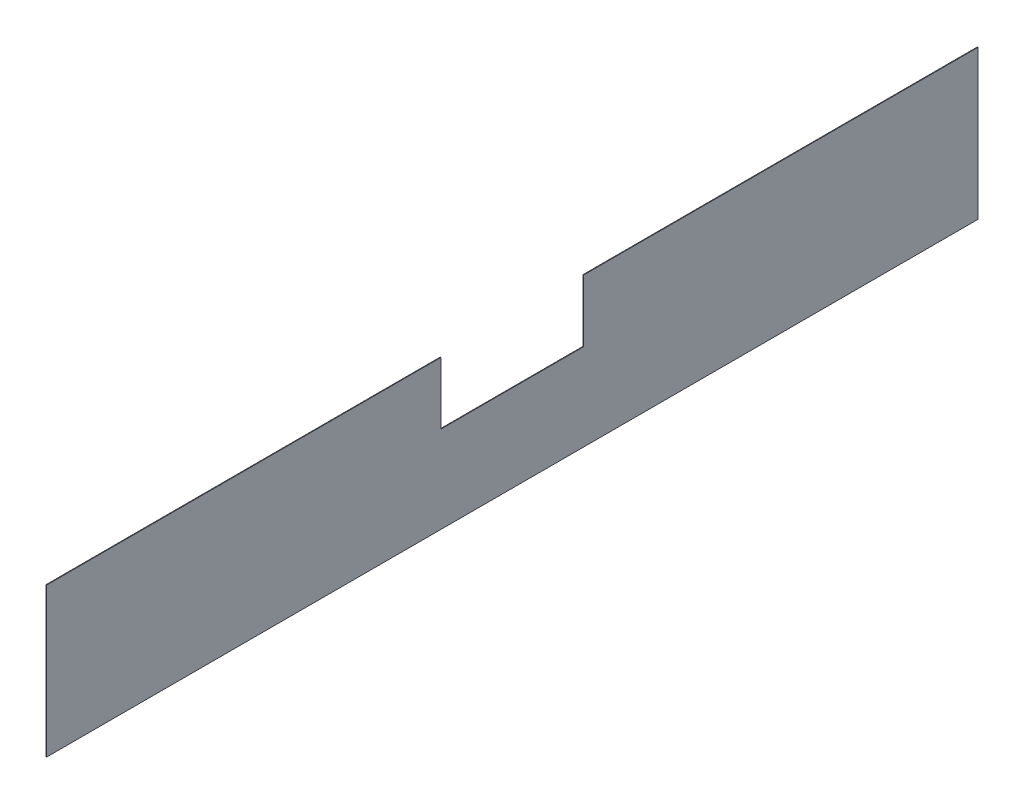
ISO-10303-21;
HEADER;
FILE_DESCRIPTION(('STEP AP214'),'2;1');
FILE_NAME('part.step','',(''),(''),'','','');
FILE_SCHEMA(('AUTOMOTIVE_DESIGN { 1 0 10303 214 1 1 1 1 }'));
ENDSEC;
DATA;
#1=APPLICATION_CONTEXT('core data for automotive mechanical design processes');
#2=APPLICATION_PROTOCOL_DEFINITION('international standard','automotive_design',2000,#1);
#3=PRODUCT_CONTEXT('',#1,'mechanical');
#4=PRODUCT('Part','Part','',(#3));
#5=PRODUCT_RELATED_PRODUCT_CATEGORY('part','',(#4));
#6=PRODUCT_DEFINITION_FORMATION('','',#4);
#7=PRODUCT_DEFINITION_CONTEXT('part definition',#1,'design');
#8=PRODUCT_DEFINITION('design','',#6,#7);
#9=PRODUCT_DEFINITION_SHAPE('','',#8);
#10=(LENGTH_UNIT() NAMED_UNIT(*) SI_UNIT(.MILLI.,.METRE.));
#11=(NAMED_UNIT(*) PLANE_ANGLE_UNIT() SI_UNIT($,.RADIAN.));
#12=(NAMED_UNIT(*) SI_UNIT($,.STERADIAN.) SOLID_ANGLE_UNIT());
#13=UNCERTAINTY_MEASURE_WITH_UNIT(LENGTH_MEASURE(1.E-05),#10,'distance_accuracy_value','');
#14=(GEOMETRIC_REPRESENTATION_CONTEXT(3) GLOBAL_UNCERTAINTY_ASSIGNED_CONTEXT((#13)) GLOBAL_UNIT_ASSIGNED_CONTEXT((#10,
#11,#12)) REPRESENTATION_CONTEXT('',''));
#15=CARTESIAN_POINT('',(0.,0.,0.));
#16=DIRECTION('',(0.,0.,1.));
#17=DIRECTION('',(1.,0.,0.));
#18=AXIS2_PLACEMENT_3D('',#15,#16,#17);
#19=CARTESIAN_POINT('',(-125.2,60.001,150.));
#20=DIRECTION('',(0.,1.,0.));
#21=DIRECTION('',(0.,0.,1.));
#22=AXIS2_PLACEMENT_3D('',#19,#20,#21);
#23=PLANE('',#22);
#24=DIRECTION('',(-1.,0.,0.));
#25=VECTOR('',#24,1.);
#26=CARTESIAN_POINT('',(-115.2,60.001,-23.));
#27=LINE('',#26,#25);
#28=CARTESIAN_POINT('',(-125.,60.001,-23.));
#29=VERTEX_POINT('',#28);
#30=CARTESIAN_POINT('',(-125.2,60.001,-23.));
#31=VERTEX_POINT('',#30);
#32=EDGE_CURVE('E125',#29,#31,#27,.T.);
#33=ORIENTED_EDGE('',*,*,#32,.F.);
#34=DIRECTION('',(0.,0.,1.));
#35=VECTOR('',#34,1.);
#36=CARTESIAN_POINT('',(-125.,60.001,150.));
#37=LINE('',#36,#35);
#38=CARTESIAN_POINT('',(-125.,60.001,-150.));
#39=VERTEX_POINT('',#38);
#40=EDGE_CURVE('E164',#39,#29,#37,.T.);
#41=ORIENTED_EDGE('',*,*,#40,.F.);
#42=DIRECTION('',(1.,0.,0.));
#43=VECTOR('',#42,1.);
#44=CARTESIAN_POINT('',(-125.2,60.001,-150.));
#45=LINE('',#44,#43);
#46=CARTESIAN_POINT('',(-125.2,60.001,-150.));
#47=VERTEX_POINT('',#46);
#48=EDGE_CURVE('E171',#47,#39,#45,.T.);
#49=ORIENTED_EDGE('',*,*,#48,.F.);
#50=DIRECTION('',(0.,0.,1.));
#51=VECTOR('',#50,1.);
#52=CARTESIAN_POINT('',(-125.2,60.001,150.));
#53=LINE('',#52,#51);
#54=EDGE_CURVE('E168',#47,#31,#53,.T.);
#55=ORIENTED_EDGE('',*,*,#54,.T.);
#56=EDGE_LOOP('',(#33,#41,#49,#55));
#57=FACE_BOUND('',#56,.T.);
#58=ADVANCED_FACE('F45',(#57),#23,.T.);
#59=CARTESIAN_POINT('',(-125.2,-60.,150.));
#60=DIRECTION('',(0.,0.,1.));
#61=DIRECTION('',(0.,-1.,0.));
#62=AXIS2_PLACEMENT_3D('',#59,#60,#61);
#63=PLANE('',#62);
#64=DIRECTION('',(1.,0.,0.));
#65=VECTOR('',#64,1.);
#66=CARTESIAN_POINT('',(-135.,12.,150.));
#67=LINE('',#66,#65);
#68=CARTESIAN_POINT('',(-125.2,12.,150.));
#69=VERTEX_POINT('',#68);
#70=CARTESIAN_POINT('',(-125.,12.,150.));
#71=VERTEX_POINT('',#70);
#72=EDGE_CURVE('E149',#69,#71,#67,.T.);
#73=ORIENTED_EDGE('',*,*,#72,.T.);
#74=DIRECTION('',(0.,-1.,0.));
#75=VECTOR('',#74,1.);
#76=CARTESIAN_POINT('',(-125.,-60.,150.));
#77=LINE('',#76,#75);
#78=CARTESIAN_POINT('',(-125.,60.001,150.));
#79=VERTEX_POINT('',#78);
#80=EDGE_CURVE('E158',#79,#71,#77,.T.);
#81=ORIENTED_EDGE('',*,*,#80,.F.);
#82=DIRECTION('',(1.,0.,0.));
#83=VECTOR('',#82,1.);
#84=CARTESIAN_POINT('',(-125.2,60.001,150.));
#85=LINE('',#84,#83);
#86=CARTESIAN_POINT('',(-125.2,60.001,150.));
#87=VERTEX_POINT('',#86);
#88=EDGE_CURVE('E182',#87,#79,#85,.T.);
#89=ORIENTED_EDGE('',*,*,#88,.F.);
#90=DIRECTION('',(0.,-1.,0.));
#91=VECTOR('',#90,1.);
#92=CARTESIAN_POINT('',(-125.2,-60.,150.));
#93=LINE('',#92,#91);
#94=EDGE_CURVE('E159',#87,#69,#93,.T.);
#95=ORIENTED_EDGE('',*,*,#94,.T.);
#96=EDGE_LOOP('',(#73,#81,#89,#95));
#97=FACE_BOUND('',#96,.T.);
#98=ADVANCED_FACE('F47',(#97),#63,.T.);
#99=DIRECTION('',(-1.,0.,0.));
#100=VECTOR('',#99,1.);
#101=CARTESIAN_POINT('',(-115.2,60.001,23.));
#102=LINE('',#101,#100);
#103=CARTESIAN_POINT('',(-125.,60.001,23.));
#104=VERTEX_POINT('',#103);
#105=CARTESIAN_POINT('',(-125.2,60.001,23.));
#106=VERTEX_POINT('',#105);
#107=EDGE_CURVE('E141',#104,#106,#102,.T.);
#108=ORIENTED_EDGE('',*,*,#107,.T.);
#109=EDGE_CURVE('E167',#106,#87,#53,.T.);
#110=ORIENTED_EDGE('',*,*,#109,.T.);
#111=ORIENTED_EDGE('',*,*,#88,.T.);
#112=EDGE_CURVE('E178',#104,#79,#37,.T.);
#113=ORIENTED_EDGE('',*,*,#112,.F.);
#114=EDGE_LOOP('',(#108,#110,#111,#113));
#115=FACE_BOUND('',#114,.T.);
#116=ADVANCED_FACE('F197',(#115),#23,.T.);
#117=CARTESIAN_POINT('',(-125.2,-60.,-150.));
#118=DIRECTION('',(0.,0.,-1.));
#119=DIRECTION('',(0.,1.,0.));
#120=AXIS2_PLACEMENT_3D('',#117,#118,#119);
#121=PLANE('',#120);
#122=DIRECTION('',(1.,0.,0.));
#123=VECTOR('',#122,1.);
#124=CARTESIAN_POINT('',(-135.,12.,-150.));
#125=LINE('',#124,#123);
#126=CARTESIAN_POINT('',(-125.2,12.,-150.));
#127=VERTEX_POINT('',#126);
#128=CARTESIAN_POINT('',(-125.,12.,-150.));
#129=VERTEX_POINT('',#128);
#130=EDGE_CURVE('E69',#127,#129,#125,.T.);
#131=ORIENTED_EDGE('',*,*,#130,.F.);
#132=DIRECTION('',(0.,1.,0.));
#133=VECTOR('',#132,1.);
#134=CARTESIAN_POINT('',(-125.2,-60.,-150.));
#135=LINE('',#134,#133);
#136=EDGE_CURVE('E163',#127,#47,#135,.T.);
#137=ORIENTED_EDGE('',*,*,#136,.T.);
#138=ORIENTED_EDGE('',*,*,#48,.T.);
#139=DIRECTION('',(0.,1.,0.));
#140=VECTOR('',#139,1.);
#141=CARTESIAN_POINT('',(-125.,-60.,-150.));
#142=LINE('',#141,#140);
#143=EDGE_CURVE('E175',#129,#39,#142,.T.);
#144=ORIENTED_EDGE('',*,*,#143,.F.);
#145=EDGE_LOOP('',(#131,#137,#138,#144));
#146=FACE_BOUND('',#145,.T.);
#147=ADVANCED_FACE('F209',(#146),#121,.T.);
#148=CARTESIAN_POINT('',(-125.2,0.,0.));
#149=DIRECTION('',(-1.,0.,0.));
#150=DIRECTION('',(0.,0.,1.));
#151=AXIS2_PLACEMENT_3D('',#148,#149,#150);
#152=PLANE('',#151);
#153=DIRECTION('',(0.,-1.,0.));
#154=VECTOR('',#153,1.);
#155=CARTESIAN_POINT('',(-125.2,60.001,-23.));
#156=LINE('',#155,#154);
#157=CARTESIAN_POINT('',(-125.2,40.001,-23.));
#158=VERTEX_POINT('',#157);
#159=EDGE_CURVE('E122',#31,#158,#156,.T.);
#160=ORIENTED_EDGE('',*,*,#159,.F.);
#161=ORIENTED_EDGE('',*,*,#54,.F.);
#162=ORIENTED_EDGE('',*,*,#136,.F.);
#163=DIRECTION('',(0.,0.,-1.));
#164=VECTOR('',#163,1.);
#165=CARTESIAN_POINT('',(-125.2,12.,0.));
#166=LINE('',#165,#164);
#167=EDGE_CURVE('E153',#69,#127,#166,.T.);
#168=ORIENTED_EDGE('',*,*,#167,.F.);
#169=ORIENTED_EDGE('',*,*,#94,.F.);
#170=ORIENTED_EDGE('',*,*,#109,.F.);
#171=DIRECTION('',(0.,1.,0.));
#172=VECTOR('',#171,1.);
#173=CARTESIAN_POINT('',(-125.2,60.001,23.));
#174=LINE('',#173,#172);
#175=CARTESIAN_POINT('',(-125.2,40.001,23.));
#176=VERTEX_POINT('',#175);
#177=EDGE_CURVE('E119',#176,#106,#174,.T.);
#178=ORIENTED_EDGE('',*,*,#177,.F.);
#179=DIRECTION('',(0.,0.,1.));
#180=VECTOR('',#179,1.);
#181=CARTESIAN_POINT('',(-125.2,40.001,-23.));
#182=LINE('',#181,#180);
#183=EDGE_CURVE('E113',#158,#176,#182,.T.);
#184=ORIENTED_EDGE('',*,*,#183,.F.);
#185=EDGE_LOOP('',(#160,#161,#162,#168,#169,#170,#178,#184));
#186=FACE_BOUND('',#185,.T.);
#187=ADVANCED_FACE('F131',(#186),#152,.T.);
#188=CARTESIAN_POINT('',(-125.,0.,0.));
#189=DIRECTION('',(-1.,0.,0.));
#190=DIRECTION('',(0.,0.,1.));
#191=AXIS2_PLACEMENT_3D('',#188,#189,#190);
#192=PLANE('',#191);
#193=ORIENTED_EDGE('',*,*,#40,.T.);
#194=DIRECTION('',(0.,-1.,0.));
#195=VECTOR('',#194,1.);
#196=CARTESIAN_POINT('',(-125.,0.,-22.9999999999999));
#197=LINE('',#196,#195);
#198=CARTESIAN_POINT('',(-125.,40.001,-23.));
#199=VERTEX_POINT('',#198);
#200=EDGE_CURVE('E11',#29,#199,#197,.T.);
#201=ORIENTED_EDGE('',*,*,#200,.T.);
#202=DIRECTION('',(0.,0.,1.));
#203=VECTOR('',#202,1.);
#204=CARTESIAN_POINT('',(-125.,40.001,0.));
#205=LINE('',#204,#203);
#206=CARTESIAN_POINT('',(-125.,40.001,23.));
#207=VERTEX_POINT('',#206);
#208=EDGE_CURVE('E116',#199,#207,#205,.T.);
#209=ORIENTED_EDGE('',*,*,#208,.T.);
#210=DIRECTION('',(0.,1.,0.));
#211=VECTOR('',#210,1.);
#212=CARTESIAN_POINT('',(-125.,0.,23.));
#213=LINE('',#212,#211);
#214=EDGE_CURVE('E54',#207,#104,#213,.T.);
#215=ORIENTED_EDGE('',*,*,#214,.T.);
#216=ORIENTED_EDGE('',*,*,#112,.T.);
#217=ORIENTED_EDGE('',*,*,#80,.T.);
#218=DIRECTION('',(0.,0.,1.));
#219=VECTOR('',#218,1.);
#220=CARTESIAN_POINT('',(-125.,12.,150.));
#221=LINE('',#220,#219);
#222=EDGE_CURVE('E140',#129,#71,#221,.T.);
#223=ORIENTED_EDGE('',*,*,#222,.F.);
#224=ORIENTED_EDGE('',*,*,#143,.T.);
#225=EDGE_LOOP('',(#193,#201,#209,#215,#216,#217,#223,#224));
#226=FACE_BOUND('',#225,.T.);
#227=ADVANCED_FACE('F194',(#226),#192,.F.);
#228=CARTESIAN_POINT('',(-135.,12.,150.));
#229=DIRECTION('',(0.,1.,0.));
#230=DIRECTION('',(0.,0.,1.));
#231=AXIS2_PLACEMENT_3D('',#228,#229,#230);
#232=PLANE('',#231);
#233=ORIENTED_EDGE('',*,*,#167,.T.);
#234=ORIENTED_EDGE('',*,*,#130,.T.);
#235=ORIENTED_EDGE('',*,*,#222,.T.);
#236=ORIENTED_EDGE('',*,*,#72,.F.);
#237=EDGE_LOOP('',(#233,#234,#235,#236));
#238=FACE_BOUND('',#237,.T.);
#239=ADVANCED_FACE('F206',(#238),#232,.F.);
#240=CARTESIAN_POINT('',(-115.2,60.001,-23.));
#241=DIRECTION('',(0.,0.,-1.));
#242=DIRECTION('',(0.,1.,0.));
#243=AXIS2_PLACEMENT_3D('',#240,#241,#242);
#244=PLANE('',#243);
#245=ORIENTED_EDGE('',*,*,#32,.T.);
#246=ORIENTED_EDGE('',*,*,#159,.T.);
#247=DIRECTION('',(-1.,0.,0.));
#248=VECTOR('',#247,1.);
#249=CARTESIAN_POINT('',(-115.2,40.001,-23.));
#250=LINE('',#249,#248);
#251=EDGE_CURVE('E109',#199,#158,#250,.T.);
#252=ORIENTED_EDGE('',*,*,#251,.F.);
#253=ORIENTED_EDGE('',*,*,#200,.F.);
#254=EDGE_LOOP('',(#245,#246,#252,#253));
#255=FACE_BOUND('',#254,.T.);
#256=ADVANCED_FACE('F123',(#255),#244,.F.);
#257=CARTESIAN_POINT('',(-115.2,60.001,23.));
#258=DIRECTION('',(0.,0.,1.));
#259=DIRECTION('',(1.,0.,0.));
#260=AXIS2_PLACEMENT_3D('',#257,#258,#259);
#261=PLANE('',#260);
#262=DIRECTION('',(-1.,0.,0.));
#263=VECTOR('',#262,1.);
#264=CARTESIAN_POINT('',(-115.2,40.001,23.));
#265=LINE('',#264,#263);
#266=EDGE_CURVE('E61',#207,#176,#265,.T.);
#267=ORIENTED_EDGE('',*,*,#266,.T.);
#268=ORIENTED_EDGE('',*,*,#177,.T.);
#269=ORIENTED_EDGE('',*,*,#107,.F.);
#270=ORIENTED_EDGE('',*,*,#214,.F.);
#271=EDGE_LOOP('',(#267,#268,#269,#270));
#272=FACE_BOUND('',#271,.T.);
#273=ADVANCED_FACE('F235',(#272),#261,.F.);
#274=CARTESIAN_POINT('',(-115.2,40.001,-23.));
#275=DIRECTION('',(0.,-1.,0.));
#276=DIRECTION('',(0.,0.,-1.));
#277=AXIS2_PLACEMENT_3D('',#274,#275,#276);
#278=PLANE('',#277);
#279=ORIENTED_EDGE('',*,*,#251,.T.);
#280=ORIENTED_EDGE('',*,*,#183,.T.);
#281=ORIENTED_EDGE('',*,*,#266,.F.);
#282=ORIENTED_EDGE('',*,*,#208,.F.);
#283=EDGE_LOOP('',(#279,#280,#281,#282));
#284=FACE_BOUND('',#283,.T.);
#285=ADVANCED_FACE('F111',(#284),#278,.F.);
#286=CLOSED_SHELL('',(#58,#98,#116,#147,#187,#227,#239,#256,#273,#285));
#287=MANIFOLD_SOLID_BREP('B2',#286);
#288=ADVANCED_BREP_SHAPE_REPRESENTATION('',(#18,#287),#14);
#289=SHAPE_DEFINITION_REPRESENTATION(#9,#288);
ENDSEC;
END-ISO-10303-21;
